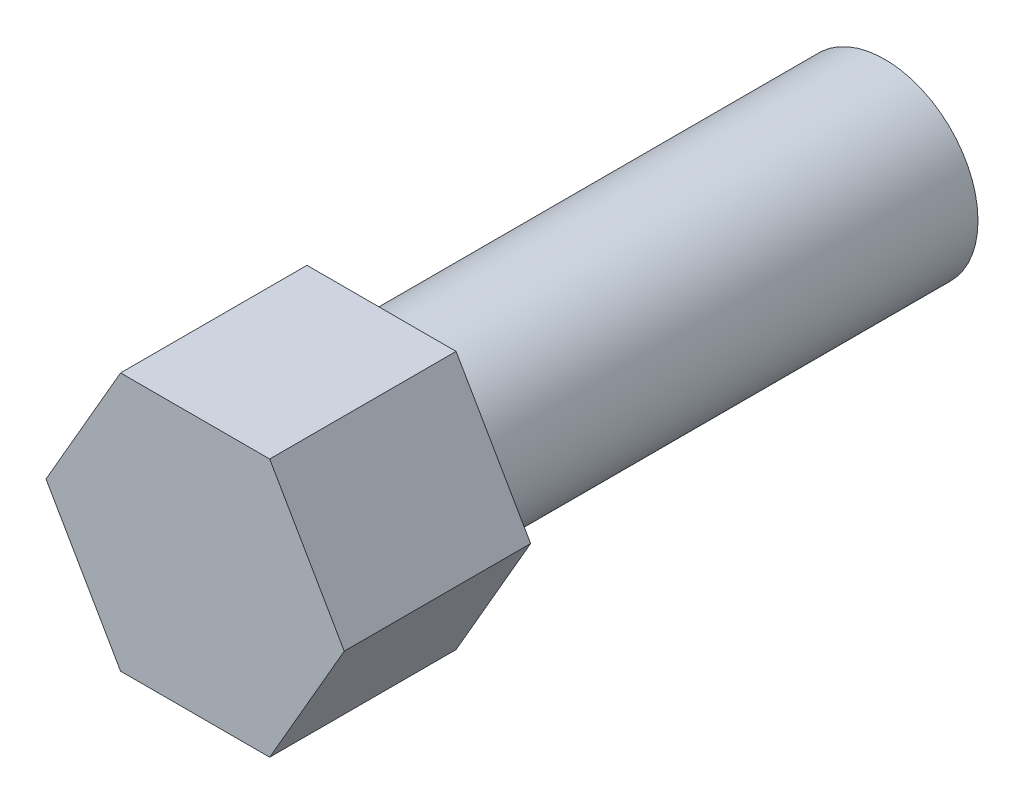
ISO-10303-21;
HEADER;
FILE_DESCRIPTION(('STEP AP214'),'2;1');
FILE_NAME('part.step','',(''),(''),'','','');
FILE_SCHEMA(('AUTOMOTIVE_DESIGN { 1 0 10303 214 1 1 1 1 }'));
ENDSEC;
DATA;
#1=APPLICATION_CONTEXT('core data for automotive mechanical design processes');
#2=APPLICATION_PROTOCOL_DEFINITION('international standard','automotive_design',2000,#1);
#3=PRODUCT_CONTEXT('',#1,'mechanical');
#4=PRODUCT('Part','Part','',(#3));
#5=PRODUCT_RELATED_PRODUCT_CATEGORY('part','',(#4));
#6=PRODUCT_DEFINITION_FORMATION('','',#4);
#7=PRODUCT_DEFINITION_CONTEXT('part definition',#1,'design');
#8=PRODUCT_DEFINITION('design','',#6,#7);
#9=PRODUCT_DEFINITION_SHAPE('','',#8);
#10=(LENGTH_UNIT() NAMED_UNIT(*) SI_UNIT(.MILLI.,.METRE.));
#11=(NAMED_UNIT(*) PLANE_ANGLE_UNIT() SI_UNIT($,.RADIAN.));
#12=(NAMED_UNIT(*) SI_UNIT($,.STERADIAN.) SOLID_ANGLE_UNIT());
#13=UNCERTAINTY_MEASURE_WITH_UNIT(LENGTH_MEASURE(1.E-05),#10,'distance_accuracy_value','');
#14=(GEOMETRIC_REPRESENTATION_CONTEXT(3) GLOBAL_UNCERTAINTY_ASSIGNED_CONTEXT((#13)) GLOBAL_UNIT_ASSIGNED_CONTEXT((#10,
#11,#12)) REPRESENTATION_CONTEXT('',''));
#15=CARTESIAN_POINT('',(0.,0.,0.));
#16=DIRECTION('',(0.,0.,1.));
#17=DIRECTION('',(1.,0.,0.));
#18=AXIS2_PLACEMENT_3D('',#15,#16,#17);
#19=CARTESIAN_POINT('',(0.,0.,-45.));
#20=DIRECTION('',(0.,0.,1.));
#21=DIRECTION('',(1.,0.,0.));
#22=AXIS2_PLACEMENT_3D('',#19,#20,#21);
#23=CYLINDRICAL_SURFACE('',#22,5.);
#24=CARTESIAN_POINT('',(0.,0.,0.));
#25=DIRECTION('',(0.,0.,1.));
#26=DIRECTION('',(1.,0.,0.));
#27=AXIS2_PLACEMENT_3D('',#24,#25,#26);
#28=CIRCLE('',#27,5.);
#29=CARTESIAN_POINT('',(5.,0.,0.));
#30=VERTEX_POINT('',#29);
#31=EDGE_CURVE('E11',#30,#30,#28,.F.);
#32=CARTESIAN_POINT('',(0.,0.,-27.));
#33=DIRECTION('',(0.,0.,-1.));
#34=DIRECTION('',(-1.,0.,0.));
#35=AXIS2_PLACEMENT_3D('',#32,#33,#34);
#36=CIRCLE('',#35,5.);
#37=CARTESIAN_POINT('',(5.,0.,-27.));
#38=VERTEX_POINT('',#37);
#39=EDGE_CURVE('E184',#38,#38,#36,.T.);
#40=CARTESIAN_POINT('',(5.,0.,0.));
#41=CARTESIAN_POINT('',(5.,0.,-0.281250000000006));
#42=CARTESIAN_POINT('',(5.,0.,-0.562500000000005));
#43=CARTESIAN_POINT('',(5.,0.,-1.12500000000001));
#44=CARTESIAN_POINT('',(5.,0.,-1.40625000000001));
#45=CARTESIAN_POINT('',(5.,0.,-1.96875000000001));
#46=CARTESIAN_POINT('',(5.,0.,-2.25000000000001));
#47=CARTESIAN_POINT('',(5.,0.,-2.81250000000001));
#48=CARTESIAN_POINT('',(5.,0.,-3.09375000000001));
#49=CARTESIAN_POINT('',(5.,0.,-3.65625000000001));
#50=CARTESIAN_POINT('',(5.,0.,-3.93750000000001));
#51=CARTESIAN_POINT('',(5.,0.,-4.50000000000001));
#52=CARTESIAN_POINT('',(5.,0.,-4.78125000000001));
#53=CARTESIAN_POINT('',(5.,0.,-5.34375000000001));
#54=CARTESIAN_POINT('',(5.,0.,-5.62500000000001));
#55=CARTESIAN_POINT('',(5.,0.,-6.18750000000001));
#56=CARTESIAN_POINT('',(5.,0.,-6.46875000000001));
#57=CARTESIAN_POINT('',(5.,0.,-7.03125000000001));
#58=CARTESIAN_POINT('',(5.,0.,-7.3125));
#59=CARTESIAN_POINT('',(5.,0.,-7.87500000000001));
#60=CARTESIAN_POINT('',(5.,0.,-8.15625000000001));
#61=CARTESIAN_POINT('',(5.,0.,-8.71875000000001));
#62=CARTESIAN_POINT('',(5.,0.,-9.00000000000001));
#63=CARTESIAN_POINT('',(5.,0.,-9.5625));
#64=CARTESIAN_POINT('',(5.,0.,-9.84375));
#65=CARTESIAN_POINT('',(5.,0.,-10.40625));
#66=CARTESIAN_POINT('',(5.,0.,-10.6875));
#67=CARTESIAN_POINT('',(5.,0.,-11.25));
#68=CARTESIAN_POINT('',(5.,0.,-11.53125));
#69=CARTESIAN_POINT('',(5.,0.,-12.09375));
#70=CARTESIAN_POINT('',(5.,0.,-12.375));
#71=CARTESIAN_POINT('',(5.,0.,-12.9375));
#72=CARTESIAN_POINT('',(5.,0.,-13.21875));
#73=CARTESIAN_POINT('',(5.,0.,-13.78125));
#74=CARTESIAN_POINT('',(5.,0.,-14.0625));
#75=CARTESIAN_POINT('',(5.,0.,-14.625));
#76=CARTESIAN_POINT('',(5.,0.,-14.90625));
#77=CARTESIAN_POINT('',(5.,0.,-15.46875));
#78=CARTESIAN_POINT('',(5.,0.,-15.75));
#79=CARTESIAN_POINT('',(5.,0.,-16.3125));
#80=CARTESIAN_POINT('',(5.,0.,-16.59375));
#81=CARTESIAN_POINT('',(5.,0.,-17.15625));
#82=CARTESIAN_POINT('',(5.,0.,-17.4375));
#83=CARTESIAN_POINT('',(5.,0.,-18.));
#84=CARTESIAN_POINT('',(5.,0.,-18.28125));
#85=CARTESIAN_POINT('',(5.,0.,-18.84375));
#86=CARTESIAN_POINT('',(5.,0.,-19.125));
#87=CARTESIAN_POINT('',(5.,0.,-19.6875));
#88=CARTESIAN_POINT('',(5.,0.,-19.96875));
#89=CARTESIAN_POINT('',(5.,0.,-20.53125));
#90=CARTESIAN_POINT('',(5.,0.,-20.8125));
#91=CARTESIAN_POINT('',(5.,0.,-21.375));
#92=CARTESIAN_POINT('',(5.,0.,-21.65625));
#93=CARTESIAN_POINT('',(5.,0.,-22.21875));
#94=CARTESIAN_POINT('',(5.,0.,-22.5));
#95=CARTESIAN_POINT('',(5.,0.,-23.0625));
#96=CARTESIAN_POINT('',(5.,0.,-23.34375));
#97=CARTESIAN_POINT('',(5.,0.,-23.90625));
#98=CARTESIAN_POINT('',(5.,0.,-24.1875));
#99=CARTESIAN_POINT('',(5.,0.,-24.75));
#100=CARTESIAN_POINT('',(5.,0.,-25.03125));
#101=CARTESIAN_POINT('',(5.,0.,-25.59375));
#102=CARTESIAN_POINT('',(5.,0.,-25.875));
#103=CARTESIAN_POINT('',(5.,0.,-26.4375));
#104=CARTESIAN_POINT('',(5.,0.,-26.71875));
#105=CARTESIAN_POINT('',(5.,0.,-27.));
#106=B_SPLINE_CURVE_WITH_KNOTS('',3,(#40,#41,#42,#43,#44,#45,#46,#47,#48,#49,#50,#51,#52,#53,
#54,#55,#56,#57,#58,#59,#60,#61,#62,#63,#64,#65,#66,#67,#68,#69,#70,#71,#72,#73,#74,#75,#76,#77,
#78,#79,#80,#81,#82,#83,#84,#85,#86,#87,#88,#89,#90,#91,#92,#93,#94,#95,#96,#97,#98,#99,#100,
#101,#102,#103,#104,#105),.UNSPECIFIED.,.F.,.F.,(4,2,2,2,2,2,2,2,2,2,2,2,2,2,2,2,2,2,2,2,2,2,2,
2,2,2,2,2,2,2,2,2,4),(0.,0.843749999999997,1.6875,2.53125,3.375,4.21875,5.0625,5.90625,6.75,
7.59375,8.4375,9.28125,10.125,10.96875,11.8125,12.65625,13.5,14.34375,15.1875,16.03125,16.875,
17.71875,18.5625,19.40625,20.25,21.09375,21.9375,22.78125,23.625,24.46875,25.3125,26.15625,27.),.UNSPECIFIED.);
#107=EDGE_CURVE('BSEAM43',#30,#38,#106,.T.);
#108=ORIENTED_EDGE('',*,*,#31,.T.);
#109=ORIENTED_EDGE('',*,*,#39,.F.);
#110=ORIENTED_EDGE('',*,*,#107,.T.);
#111=ORIENTED_EDGE('',*,*,#107,.F.);
#112=EDGE_LOOP('',(#108,#110,#109,#111));
#113=FACE_BOUND('',#112,.T.);
#114=ADVANCED_FACE('F43',(#113),#23,.T.);
#115=CARTESIAN_POINT('',(0.,0.,10.));
#116=DIRECTION('',(0.,0.,1.));
#117=DIRECTION('',(1.,0.,0.));
#118=AXIS2_PLACEMENT_3D('',#115,#116,#117);
#119=PLANE('',#118);
#120=DIRECTION('',(0.5,0.866025403784439,0.));
#121=VECTOR('',#120,1.);
#122=CARTESIAN_POINT('',(4.,-6.92820323027551,10.));
#123=LINE('',#122,#121);
#124=CARTESIAN_POINT('',(4.,-6.92820323027551,10.));
#125=VERTEX_POINT('',#124);
#126=CARTESIAN_POINT('',(8.,0.,10.));
#127=VERTEX_POINT('',#126);
#128=EDGE_CURVE('E152',#125,#127,#123,.T.);
#129=ORIENTED_EDGE('',*,*,#128,.T.);
#130=DIRECTION('',(-0.5,0.866025403784438,0.));
#131=VECTOR('',#130,1.);
#132=CARTESIAN_POINT('',(8.,0.,10.));
#133=LINE('',#132,#131);
#134=CARTESIAN_POINT('',(4.,6.92820323027551,10.));
#135=VERTEX_POINT('',#134);
#136=EDGE_CURVE('E100',#127,#135,#133,.T.);
#137=ORIENTED_EDGE('',*,*,#136,.T.);
#138=DIRECTION('',(-1.,0.,0.));
#139=VECTOR('',#138,1.);
#140=CARTESIAN_POINT('',(4.,6.92820323027551,10.));
#141=LINE('',#140,#139);
#142=CARTESIAN_POINT('',(-4.,6.92820323027551,10.));
#143=VERTEX_POINT('',#142);
#144=EDGE_CURVE('E113',#135,#143,#141,.T.);
#145=ORIENTED_EDGE('',*,*,#144,.T.);
#146=DIRECTION('',(-0.5,-0.866025403784439,0.));
#147=VECTOR('',#146,1.);
#148=CARTESIAN_POINT('',(-4.,6.92820323027551,10.));
#149=LINE('',#148,#147);
#150=CARTESIAN_POINT('',(-8.,0.,10.));
#151=VERTEX_POINT('',#150);
#152=EDGE_CURVE('E107',#143,#151,#149,.T.);
#153=ORIENTED_EDGE('',*,*,#152,.T.);
#154=DIRECTION('',(0.5,-0.866025403784439,0.));
#155=VECTOR('',#154,1.);
#156=CARTESIAN_POINT('',(-8.,0.,10.));
#157=LINE('',#156,#155);
#158=CARTESIAN_POINT('',(-4.,-6.92820323027551,10.));
#159=VERTEX_POINT('',#158);
#160=EDGE_CURVE('E111',#151,#159,#157,.T.);
#161=ORIENTED_EDGE('',*,*,#160,.T.);
#162=DIRECTION('',(1.,0.,0.));
#163=VECTOR('',#162,1.);
#164=CARTESIAN_POINT('',(-4.,-6.92820323027551,10.));
#165=LINE('',#164,#163);
#166=EDGE_CURVE('E62',#159,#125,#165,.T.);
#167=ORIENTED_EDGE('',*,*,#166,.T.);
#168=EDGE_LOOP('',(#129,#137,#145,#153,#161,#167));
#169=FACE_BOUND('',#168,.T.);
#170=ADVANCED_FACE('F109',(#169),#119,.T.);
#171=CARTESIAN_POINT('',(8.,0.,10.));
#172=DIRECTION('',(-0.866025403784438,-0.5,0.));
#173=DIRECTION('',(0.5,-0.866025403784439,0.));
#174=AXIS2_PLACEMENT_3D('',#171,#172,#173);
#175=PLANE('',#174);
#176=DIRECTION('',(-0.5,0.866025403784438,0.));
#177=VECTOR('',#176,1.);
#178=CARTESIAN_POINT('',(8.,0.,0.));
#179=LINE('',#178,#177);
#180=CARTESIAN_POINT('',(8.,0.,0.));
#181=VERTEX_POINT('',#180);
#182=CARTESIAN_POINT('',(4.,6.92820323027551,0.));
#183=VERTEX_POINT('',#182);
#184=EDGE_CURVE('E139',#181,#183,#179,.T.);
#185=ORIENTED_EDGE('',*,*,#184,.T.);
#186=DIRECTION('',(0.,0.,-1.));
#187=VECTOR('',#186,1.);
#188=CARTESIAN_POINT('',(4.,6.92820323027551,10.));
#189=LINE('',#188,#187);
#190=EDGE_CURVE('E159',#135,#183,#189,.T.);
#191=ORIENTED_EDGE('',*,*,#190,.F.);
#192=ORIENTED_EDGE('',*,*,#136,.F.);
#193=DIRECTION('',(0.,0.,-1.));
#194=VECTOR('',#193,1.);
#195=CARTESIAN_POINT('',(8.,0.,10.));
#196=LINE('',#195,#194);
#197=EDGE_CURVE('E54',#127,#181,#196,.T.);
#198=ORIENTED_EDGE('',*,*,#197,.T.);
#199=EDGE_LOOP('',(#185,#191,#192,#198));
#200=FACE_BOUND('',#199,.T.);
#201=ADVANCED_FACE('F165',(#200),#175,.F.);
#202=CARTESIAN_POINT('',(4.,6.92820323027551,10.));
#203=DIRECTION('',(0.,-1.,0.));
#204=DIRECTION('',(0.,0.,-1.));
#205=AXIS2_PLACEMENT_3D('',#202,#203,#204);
#206=PLANE('',#205);
#207=DIRECTION('',(-1.,0.,0.));
#208=VECTOR('',#207,1.);
#209=CARTESIAN_POINT('',(4.,6.92820323027551,0.));
#210=LINE('',#209,#208);
#211=CARTESIAN_POINT('',(-4.,6.92820323027551,0.));
#212=VERTEX_POINT('',#211);
#213=EDGE_CURVE('E143',#183,#212,#210,.T.);
#214=ORIENTED_EDGE('',*,*,#213,.T.);
#215=DIRECTION('',(0.,0.,-1.));
#216=VECTOR('',#215,1.);
#217=CARTESIAN_POINT('',(-4.,6.92820323027551,10.));
#218=LINE('',#217,#216);
#219=EDGE_CURVE('E124',#143,#212,#218,.T.);
#220=ORIENTED_EDGE('',*,*,#219,.F.);
#221=ORIENTED_EDGE('',*,*,#144,.F.);
#222=ORIENTED_EDGE('',*,*,#190,.T.);
#223=EDGE_LOOP('',(#214,#220,#221,#222));
#224=FACE_BOUND('',#223,.T.);
#225=ADVANCED_FACE('F174',(#224),#206,.F.);
#226=CARTESIAN_POINT('',(-4.,6.92820323027551,10.));
#227=DIRECTION('',(0.866025403784439,-0.5,0.));
#228=DIRECTION('',(0.5,0.866025403784439,0.));
#229=AXIS2_PLACEMENT_3D('',#226,#227,#228);
#230=PLANE('',#229);
#231=DIRECTION('',(-0.5,-0.866025403784439,0.));
#232=VECTOR('',#231,1.);
#233=CARTESIAN_POINT('',(-4.,6.92820323027551,0.));
#234=LINE('',#233,#232);
#235=CARTESIAN_POINT('',(-8.,0.,0.));
#236=VERTEX_POINT('',#235);
#237=EDGE_CURVE('E122',#212,#236,#234,.T.);
#238=ORIENTED_EDGE('',*,*,#237,.T.);
#239=DIRECTION('',(0.,0.,-1.));
#240=VECTOR('',#239,1.);
#241=CARTESIAN_POINT('',(-8.,0.,10.));
#242=LINE('',#241,#240);
#243=EDGE_CURVE('E119',#151,#236,#242,.T.);
#244=ORIENTED_EDGE('',*,*,#243,.F.);
#245=ORIENTED_EDGE('',*,*,#152,.F.);
#246=ORIENTED_EDGE('',*,*,#219,.T.);
#247=EDGE_LOOP('',(#238,#244,#245,#246));
#248=FACE_BOUND('',#247,.T.);
#249=ADVANCED_FACE('F120',(#248),#230,.F.);
#250=CARTESIAN_POINT('',(-8.,0.,10.));
#251=DIRECTION('',(0.866025403784439,0.5,0.));
#252=DIRECTION('',(-0.5,0.866025403784439,0.));
#253=AXIS2_PLACEMENT_3D('',#250,#251,#252);
#254=PLANE('',#253);
#255=DIRECTION('',(0.5,-0.866025403784439,0.));
#256=VECTOR('',#255,1.);
#257=CARTESIAN_POINT('',(-8.,0.,0.));
#258=LINE('',#257,#256);
#259=CARTESIAN_POINT('',(-4.,-6.92820323027551,0.));
#260=VERTEX_POINT('',#259);
#261=EDGE_CURVE('E85',#236,#260,#258,.T.);
#262=ORIENTED_EDGE('',*,*,#261,.T.);
#263=DIRECTION('',(0.,0.,-1.));
#264=VECTOR('',#263,1.);
#265=CARTESIAN_POINT('',(-4.,-6.92820323027551,10.));
#266=LINE('',#265,#264);
#267=EDGE_CURVE('E125',#159,#260,#266,.T.);
#268=ORIENTED_EDGE('',*,*,#267,.F.);
#269=ORIENTED_EDGE('',*,*,#160,.F.);
#270=ORIENTED_EDGE('',*,*,#243,.T.);
#271=EDGE_LOOP('',(#262,#268,#269,#270));
#272=FACE_BOUND('',#271,.T.);
#273=ADVANCED_FACE('F127',(#272),#254,.F.);
#274=CARTESIAN_POINT('',(-4.,-6.92820323027551,10.));
#275=DIRECTION('',(0.,1.,0.));
#276=DIRECTION('',(0.,0.,1.));
#277=AXIS2_PLACEMENT_3D('',#274,#275,#276);
#278=PLANE('',#277);
#279=DIRECTION('',(1.,0.,0.));
#280=VECTOR('',#279,1.);
#281=CARTESIAN_POINT('',(-4.,-6.92820323027551,0.));
#282=LINE('',#281,#280);
#283=CARTESIAN_POINT('',(4.,-6.92820323027551,0.));
#284=VERTEX_POINT('',#283);
#285=EDGE_CURVE('E91',#260,#284,#282,.T.);
#286=ORIENTED_EDGE('',*,*,#285,.T.);
#287=DIRECTION('',(0.,0.,-1.));
#288=VECTOR('',#287,1.);
#289=CARTESIAN_POINT('',(4.,-6.92820323027551,10.));
#290=LINE('',#289,#288);
#291=EDGE_CURVE('E131',#125,#284,#290,.T.);
#292=ORIENTED_EDGE('',*,*,#291,.F.);
#293=ORIENTED_EDGE('',*,*,#166,.F.);
#294=ORIENTED_EDGE('',*,*,#267,.T.);
#295=EDGE_LOOP('',(#286,#292,#293,#294));
#296=FACE_BOUND('',#295,.T.);
#297=ADVANCED_FACE('F219',(#296),#278,.F.);
#298=CARTESIAN_POINT('',(4.,-6.92820323027551,10.));
#299=DIRECTION('',(-0.866025403784439,0.5,0.));
#300=DIRECTION('',(-0.5,-0.866025403784439,0.));
#301=AXIS2_PLACEMENT_3D('',#298,#299,#300);
#302=PLANE('',#301);
#303=DIRECTION('',(0.5,0.866025403784439,0.));
#304=VECTOR('',#303,1.);
#305=CARTESIAN_POINT('',(4.,-6.92820323027551,0.));
#306=LINE('',#305,#304);
#307=EDGE_CURVE('E135',#284,#181,#306,.T.);
#308=ORIENTED_EDGE('',*,*,#307,.T.);
#309=ORIENTED_EDGE('',*,*,#197,.F.);
#310=ORIENTED_EDGE('',*,*,#128,.F.);
#311=ORIENTED_EDGE('',*,*,#291,.T.);
#312=EDGE_LOOP('',(#308,#309,#310,#311));
#313=FACE_BOUND('',#312,.T.);
#314=ADVANCED_FACE('F45',(#313),#302,.F.);
#315=CARTESIAN_POINT('',(0.,0.,0.));
#316=DIRECTION('',(0.,0.,1.));
#317=DIRECTION('',(1.,0.,0.));
#318=AXIS2_PLACEMENT_3D('',#315,#316,#317);
#319=PLANE('',#318);
#320=ORIENTED_EDGE('',*,*,#307,.F.);
#321=ORIENTED_EDGE('',*,*,#285,.F.);
#322=ORIENTED_EDGE('',*,*,#261,.F.);
#323=ORIENTED_EDGE('',*,*,#237,.F.);
#324=ORIENTED_EDGE('',*,*,#213,.F.);
#325=ORIENTED_EDGE('',*,*,#184,.F.);
#326=EDGE_LOOP('',(#320,#321,#322,#323,#324,#325));
#327=FACE_BOUND('',#326,.T.);
#328=ORIENTED_EDGE('',*,*,#31,.F.);
#329=EDGE_LOOP('',(#328));
#330=FACE_BOUND('',#329,.T.);
#331=ADVANCED_FACE('F170',(#327,#330),#319,.F.);
#332=CARTESIAN_POINT('',(0.,0.,-27.));
#333=DIRECTION('',(0.,0.,-1.));
#334=DIRECTION('',(-1.,0.,0.));
#335=AXIS2_PLACEMENT_3D('',#332,#333,#334);
#336=PLANE('',#335);
#337=CARTESIAN_POINT('',(0.,0.,-27.));
#338=DIRECTION('',(0.,0.,-1.));
#339=DIRECTION('',(-1.,0.,0.));
#340=AXIS2_PLACEMENT_3D('',#337,#338,#339);
#341=CIRCLE('',#340,2.5);
#342=CARTESIAN_POINT('',(-2.5,0.,-27.));
#343=VERTEX_POINT('',#342);
#344=EDGE_CURVE('E47',#343,#343,#341,.T.);
#345=ORIENTED_EDGE('',*,*,#344,.F.);
#346=EDGE_LOOP('',(#345));
#347=FACE_BOUND('',#346,.T.);
#348=ORIENTED_EDGE('',*,*,#39,.T.);
#349=EDGE_LOOP('',(#348));
#350=FACE_BOUND('',#349,.T.);
#351=ADVANCED_FACE('F195',(#347,#350),#336,.T.);
#352=CARTESIAN_POINT('',(0.,0.,0.));
#353=DIRECTION('',(0.,0.,-1.));
#354=DIRECTION('',(-1.,0.,0.));
#355=AXIS2_PLACEMENT_3D('',#352,#353,#354);
#356=CIRCLE('',#355,2.5);
#357=CARTESIAN_POINT('',(-2.5,0.,0.));
#358=VERTEX_POINT('',#357);
#359=EDGE_CURVE('E140',#358,#358,#356,.T.);
#360=ORIENTED_EDGE('',*,*,#359,.T.);
#361=EDGE_LOOP('',(#360));
#362=FACE_BOUND('',#361,.T.);
#363=ADVANCED_FACE('F197',(#362),#319,.F.);
#364=CARTESIAN_POINT('',(0.,0.,-120.));
#365=DIRECTION('',(0.,0.,1.));
#366=DIRECTION('',(1.,0.,0.));
#367=AXIS2_PLACEMENT_3D('',#364,#365,#366);
#368=CYLINDRICAL_SURFACE('',#367,2.5);
#369=ORIENTED_EDGE('',*,*,#359,.F.);
#370=EDGE_LOOP('',(#369));
#371=FACE_BOUND('',#370,.T.);
#372=ORIENTED_EDGE('',*,*,#344,.T.);
#373=EDGE_LOOP('',(#372));
#374=FACE_BOUND('',#373,.T.);
#375=ADVANCED_FACE('F193',(#371,#374),#368,.F.);
#376=CLOSED_SHELL('',(#114,#170,#201,#225,#249,#273,#297,#314,#331,#351,#363,#375));
#377=MANIFOLD_SOLID_BREP('B2',#376);
#378=ADVANCED_BREP_SHAPE_REPRESENTATION('',(#18,#377),#14);
#379=SHAPE_DEFINITION_REPRESENTATION(#9,#378);
ENDSEC;
END-ISO-10303-21;
